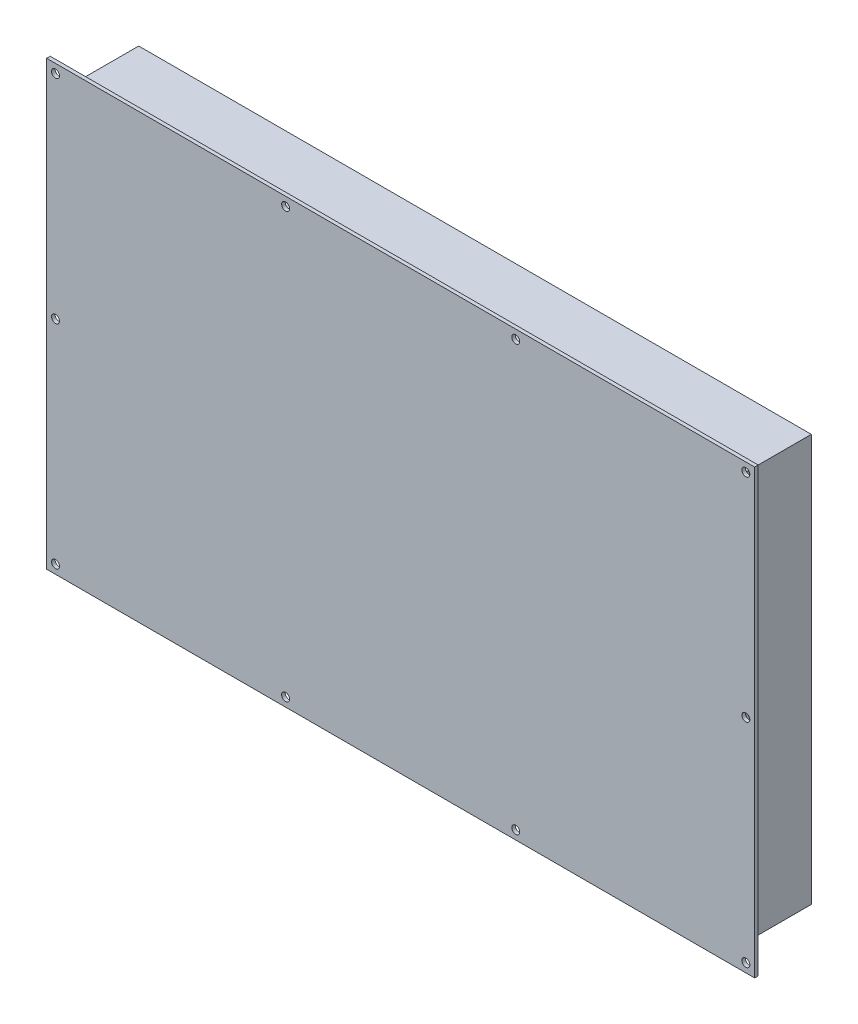
ISO-10303-21;
HEADER;
FILE_DESCRIPTION(('STEP AP214'),'2;1');
FILE_NAME('part.step','',(''),(''),'','','');
FILE_SCHEMA(('AUTOMOTIVE_DESIGN { 1 0 10303 214 1 1 1 1 }'));
ENDSEC;
DATA;
#1=APPLICATION_CONTEXT('core data for automotive mechanical design processes');
#2=APPLICATION_PROTOCOL_DEFINITION('international standard','automotive_design',2000,#1);
#3=PRODUCT_CONTEXT('',#1,'mechanical');
#4=PRODUCT('Part','Part','',(#3));
#5=PRODUCT_RELATED_PRODUCT_CATEGORY('part','',(#4));
#6=PRODUCT_DEFINITION_FORMATION('','',#4);
#7=PRODUCT_DEFINITION_CONTEXT('part definition',#1,'design');
#8=PRODUCT_DEFINITION('design','',#6,#7);
#9=PRODUCT_DEFINITION_SHAPE('','',#8);
#10=(LENGTH_UNIT() NAMED_UNIT(*) SI_UNIT(.MILLI.,.METRE.));
#11=(NAMED_UNIT(*) PLANE_ANGLE_UNIT() SI_UNIT($,.RADIAN.));
#12=(NAMED_UNIT(*) SI_UNIT($,.STERADIAN.) SOLID_ANGLE_UNIT());
#13=UNCERTAINTY_MEASURE_WITH_UNIT(LENGTH_MEASURE(1.E-05),#10,'distance_accuracy_value','');
#14=(GEOMETRIC_REPRESENTATION_CONTEXT(3) GLOBAL_UNCERTAINTY_ASSIGNED_CONTEXT((#13)) GLOBAL_UNIT_ASSIGNED_CONTEXT((#10,
#11,#12)) REPRESENTATION_CONTEXT('',''));
#15=CARTESIAN_POINT('',(0.,0.,0.));
#16=DIRECTION('',(0.,0.,1.));
#17=DIRECTION('',(1.,0.,0.));
#18=AXIS2_PLACEMENT_3D('',#15,#16,#17);
#19=CARTESIAN_POINT('',(200.,-125.,2.));
#20=DIRECTION('',(-1.,0.,0.));
#21=DIRECTION('',(0.,0.,1.));
#22=AXIS2_PLACEMENT_3D('',#19,#20,#21);
#23=PLANE('',#22);
#24=DIRECTION('',(0.,1.,0.));
#25=VECTOR('',#24,1.);
#26=CARTESIAN_POINT('',(200.,-125.,0.));
#27=LINE('',#26,#25);
#28=CARTESIAN_POINT('',(200.,-125.,0.));
#29=VERTEX_POINT('',#28);
#30=CARTESIAN_POINT('',(200.,125.,0.));
#31=VERTEX_POINT('',#30);
#32=EDGE_CURVE('E185',#29,#31,#27,.T.);
#33=ORIENTED_EDGE('',*,*,#32,.T.);
#34=DIRECTION('',(0.,0.,-1.));
#35=VECTOR('',#34,1.);
#36=CARTESIAN_POINT('',(200.,125.,2.));
#37=LINE('',#36,#35);
#38=CARTESIAN_POINT('',(200.,125.,2.));
#39=VERTEX_POINT('',#38);
#40=EDGE_CURVE('E11',#39,#31,#37,.T.);
#41=ORIENTED_EDGE('',*,*,#40,.F.);
#42=DIRECTION('',(0.,1.,0.));
#43=VECTOR('',#42,1.);
#44=CARTESIAN_POINT('',(200.,-125.,2.));
#45=LINE('',#44,#43);
#46=CARTESIAN_POINT('',(200.,-125.,2.));
#47=VERTEX_POINT('',#46);
#48=EDGE_CURVE('E188',#47,#39,#45,.T.);
#49=ORIENTED_EDGE('',*,*,#48,.F.);
#50=DIRECTION('',(0.,0.,-1.));
#51=VECTOR('',#50,1.);
#52=CARTESIAN_POINT('',(200.,-125.,2.));
#53=LINE('',#52,#51);
#54=EDGE_CURVE('E199',#47,#29,#53,.T.);
#55=ORIENTED_EDGE('',*,*,#54,.T.);
#56=EDGE_LOOP('',(#33,#41,#49,#55));
#57=FACE_BOUND('',#56,.T.);
#58=ADVANCED_FACE('F37',(#57),#23,.F.);
#59=CARTESIAN_POINT('',(-200.,125.,2.));
#60=DIRECTION('',(0.,-1.,0.));
#61=DIRECTION('',(0.,0.,-1.));
#62=AXIS2_PLACEMENT_3D('',#59,#60,#61);
#63=PLANE('',#62);
#64=DIRECTION('',(-1.,0.,0.));
#65=VECTOR('',#64,1.);
#66=CARTESIAN_POINT('',(-200.,125.,0.));
#67=LINE('',#66,#65);
#68=CARTESIAN_POINT('',(-200.,125.,0.));
#69=VERTEX_POINT('',#68);
#70=EDGE_CURVE('E202',#31,#69,#67,.T.);
#71=ORIENTED_EDGE('',*,*,#70,.T.);
#72=DIRECTION('',(0.,0.,-1.));
#73=VECTOR('',#72,1.);
#74=CARTESIAN_POINT('',(-200.,125.,2.));
#75=LINE('',#74,#73);
#76=CARTESIAN_POINT('',(-200.,125.,2.));
#77=VERTEX_POINT('',#76);
#78=EDGE_CURVE('E44',#77,#69,#75,.T.);
#79=ORIENTED_EDGE('',*,*,#78,.F.);
#80=DIRECTION('',(-1.,0.,0.));
#81=VECTOR('',#80,1.);
#82=CARTESIAN_POINT('',(-200.,125.,2.));
#83=LINE('',#82,#81);
#84=EDGE_CURVE('E191',#39,#77,#83,.T.);
#85=ORIENTED_EDGE('',*,*,#84,.F.);
#86=ORIENTED_EDGE('',*,*,#40,.T.);
#87=EDGE_LOOP('',(#71,#79,#85,#86));
#88=FACE_BOUND('',#87,.T.);
#89=ADVANCED_FACE('F233',(#88),#63,.F.);
#90=CARTESIAN_POINT('',(-200.,-125.,2.));
#91=DIRECTION('',(1.,0.,0.));
#92=DIRECTION('',(0.,0.,-1.));
#93=AXIS2_PLACEMENT_3D('',#90,#91,#92);
#94=PLANE('',#93);
#95=DIRECTION('',(0.,-1.,0.));
#96=VECTOR('',#95,1.);
#97=CARTESIAN_POINT('',(-200.,-125.,0.));
#98=LINE('',#97,#96);
#99=CARTESIAN_POINT('',(-200.,-125.,0.));
#100=VERTEX_POINT('',#99);
#101=EDGE_CURVE('E205',#69,#100,#98,.T.);
#102=ORIENTED_EDGE('',*,*,#101,.T.);
#103=DIRECTION('',(0.,0.,-1.));
#104=VECTOR('',#103,1.);
#105=CARTESIAN_POINT('',(-200.,-125.,2.));
#106=LINE('',#105,#104);
#107=CARTESIAN_POINT('',(-200.,-125.,2.));
#108=VERTEX_POINT('',#107);
#109=EDGE_CURVE('E210',#108,#100,#106,.T.);
#110=ORIENTED_EDGE('',*,*,#109,.F.);
#111=DIRECTION('',(0.,-1.,0.));
#112=VECTOR('',#111,1.);
#113=CARTESIAN_POINT('',(-200.,-125.,2.));
#114=LINE('',#113,#112);
#115=EDGE_CURVE('E195',#77,#108,#114,.T.);
#116=ORIENTED_EDGE('',*,*,#115,.F.);
#117=ORIENTED_EDGE('',*,*,#78,.T.);
#118=EDGE_LOOP('',(#102,#110,#116,#117));
#119=FACE_BOUND('',#118,.T.);
#120=ADVANCED_FACE('F217',(#119),#94,.F.);
#121=CARTESIAN_POINT('',(-200.,-125.,2.));
#122=DIRECTION('',(0.,1.,0.));
#123=DIRECTION('',(0.,0.,1.));
#124=AXIS2_PLACEMENT_3D('',#121,#122,#123);
#125=PLANE('',#124);
#126=DIRECTION('',(1.,0.,0.));
#127=VECTOR('',#126,1.);
#128=CARTESIAN_POINT('',(-200.,-125.,0.));
#129=LINE('',#128,#127);
#130=EDGE_CURVE('E192',#100,#29,#129,.T.);
#131=ORIENTED_EDGE('',*,*,#130,.T.);
#132=ORIENTED_EDGE('',*,*,#54,.F.);
#133=DIRECTION('',(1.,0.,0.));
#134=VECTOR('',#133,1.);
#135=CARTESIAN_POINT('',(-200.,-125.,2.));
#136=LINE('',#135,#134);
#137=EDGE_CURVE('E197',#108,#47,#136,.T.);
#138=ORIENTED_EDGE('',*,*,#137,.F.);
#139=ORIENTED_EDGE('',*,*,#109,.T.);
#140=EDGE_LOOP('',(#131,#132,#138,#139));
#141=FACE_BOUND('',#140,.T.);
#142=ADVANCED_FACE('F226',(#141),#125,.F.);
#143=CARTESIAN_POINT('',(0.,0.,2.));
#144=DIRECTION('',(0.,0.,-1.));
#145=DIRECTION('',(-1.,0.,0.));
#146=AXIS2_PLACEMENT_3D('',#143,#144,#145);
#147=PLANE('',#146);
#148=CARTESIAN_POINT('',(-195.,0.,2.));
#149=DIRECTION('',(0.,0.,1.));
#150=DIRECTION('',(-1.,0.,0.));
#151=AXIS2_PLACEMENT_3D('',#148,#149,#150);
#152=CIRCLE('',#151,2.25000000000001);
#153=CARTESIAN_POINT('',(-197.25,0.,2.));
#154=VERTEX_POINT('',#153);
#155=EDGE_CURVE('E153',#154,#154,#152,.T.);
#156=ORIENTED_EDGE('',*,*,#155,.F.);
#157=EDGE_LOOP('',(#156));
#158=FACE_BOUND('',#157,.T.);
#159=CARTESIAN_POINT('',(-195.,-120.,2.));
#160=DIRECTION('',(0.,0.,1.));
#161=DIRECTION('',(-1.,0.,0.));
#162=AXIS2_PLACEMENT_3D('',#159,#160,#161);
#163=CIRCLE('',#162,2.25000000000001);
#164=CARTESIAN_POINT('',(-197.25,-120.,2.));
#165=VERTEX_POINT('',#164);
#166=EDGE_CURVE('E147',#165,#165,#163,.T.);
#167=ORIENTED_EDGE('',*,*,#166,.F.);
#168=EDGE_LOOP('',(#167));
#169=FACE_BOUND('',#168,.T.);
#170=CARTESIAN_POINT('',(195.,-120.,2.));
#171=DIRECTION('',(0.,0.,1.));
#172=DIRECTION('',(-1.,0.,0.));
#173=AXIS2_PLACEMENT_3D('',#170,#171,#172);
#174=CIRCLE('',#173,2.25000000000001);
#175=CARTESIAN_POINT('',(192.75,-120.,2.));
#176=VERTEX_POINT('',#175);
#177=EDGE_CURVE('E141',#176,#176,#174,.T.);
#178=ORIENTED_EDGE('',*,*,#177,.F.);
#179=EDGE_LOOP('',(#178));
#180=FACE_BOUND('',#179,.T.);
#181=CARTESIAN_POINT('',(195.,120.,2.));
#182=DIRECTION('',(0.,0.,1.));
#183=DIRECTION('',(1.,0.,0.));
#184=AXIS2_PLACEMENT_3D('',#181,#182,#183);
#185=CIRCLE('',#184,2.25000000000001);
#186=CARTESIAN_POINT('',(197.25,120.,2.));
#187=VERTEX_POINT('',#186);
#188=EDGE_CURVE('E134',#187,#187,#185,.T.);
#189=ORIENTED_EDGE('',*,*,#188,.F.);
#190=EDGE_LOOP('',(#189));
#191=FACE_BOUND('',#190,.T.);
#192=CARTESIAN_POINT('',(64.9999999999999,120.,2.));
#193=DIRECTION('',(0.,0.,1.));
#194=DIRECTION('',(1.,0.,0.));
#195=AXIS2_PLACEMENT_3D('',#192,#193,#194);
#196=CIRCLE('',#195,2.25000000000001);
#197=CARTESIAN_POINT('',(67.25,120.,2.));
#198=VERTEX_POINT('',#197);
#199=EDGE_CURVE('E177',#198,#198,#196,.T.);
#200=ORIENTED_EDGE('',*,*,#199,.F.);
#201=EDGE_LOOP('',(#200));
#202=FACE_BOUND('',#201,.T.);
#203=CARTESIAN_POINT('',(-65.0000000000001,120.,2.));
#204=DIRECTION('',(0.,0.,1.));
#205=DIRECTION('',(1.,0.,0.));
#206=AXIS2_PLACEMENT_3D('',#203,#204,#205);
#207=CIRCLE('',#206,2.25000000000001);
#208=CARTESIAN_POINT('',(-62.75,120.,2.));
#209=VERTEX_POINT('',#208);
#210=EDGE_CURVE('E171',#209,#209,#207,.T.);
#211=ORIENTED_EDGE('',*,*,#210,.F.);
#212=EDGE_LOOP('',(#211));
#213=FACE_BOUND('',#212,.T.);
#214=CARTESIAN_POINT('',(64.9999999999999,-120.,2.));
#215=DIRECTION('',(0.,0.,1.));
#216=DIRECTION('',(-1.,0.,0.));
#217=AXIS2_PLACEMENT_3D('',#214,#215,#216);
#218=CIRCLE('',#217,2.25000000000001);
#219=CARTESIAN_POINT('',(62.7499999999999,-120.,2.));
#220=VERTEX_POINT('',#219);
#221=EDGE_CURVE('E165',#220,#220,#218,.T.);
#222=ORIENTED_EDGE('',*,*,#221,.F.);
#223=EDGE_LOOP('',(#222));
#224=FACE_BOUND('',#223,.T.);
#225=CARTESIAN_POINT('',(-65.,-120.,2.));
#226=DIRECTION('',(0.,0.,1.));
#227=DIRECTION('',(-1.,0.,0.));
#228=AXIS2_PLACEMENT_3D('',#225,#226,#227);
#229=CIRCLE('',#228,2.25000000000001);
#230=CARTESIAN_POINT('',(-67.25,-120.,2.));
#231=VERTEX_POINT('',#230);
#232=EDGE_CURVE('E158',#231,#231,#229,.T.);
#233=ORIENTED_EDGE('',*,*,#232,.F.);
#234=EDGE_LOOP('',(#233));
#235=FACE_BOUND('',#234,.T.);
#236=CARTESIAN_POINT('',(194.999999999999,0.,2.));
#237=DIRECTION('',(0.,0.,1.));
#238=DIRECTION('',(-1.,0.,0.));
#239=AXIS2_PLACEMENT_3D('',#236,#237,#238);
#240=CIRCLE('',#239,2.25000000000001);
#241=CARTESIAN_POINT('',(192.749999999999,0.,2.));
#242=VERTEX_POINT('',#241);
#243=EDGE_CURVE('E125',#242,#242,#240,.T.);
#244=ORIENTED_EDGE('',*,*,#243,.F.);
#245=EDGE_LOOP('',(#244));
#246=FACE_BOUND('',#245,.T.);
#247=CARTESIAN_POINT('',(-195.,120.,2.));
#248=DIRECTION('',(0.,0.,1.));
#249=DIRECTION('',(1.,0.,0.));
#250=AXIS2_PLACEMENT_3D('',#247,#248,#249);
#251=CIRCLE('',#250,2.25000000000001);
#252=CARTESIAN_POINT('',(-192.75,120.,2.));
#253=VERTEX_POINT('',#252);
#254=EDGE_CURVE('E182',#253,#253,#251,.T.);
#255=ORIENTED_EDGE('',*,*,#254,.F.);
#256=EDGE_LOOP('',(#255));
#257=FACE_BOUND('',#256,.T.);
#258=ORIENTED_EDGE('',*,*,#48,.T.);
#259=ORIENTED_EDGE('',*,*,#84,.T.);
#260=ORIENTED_EDGE('',*,*,#115,.T.);
#261=ORIENTED_EDGE('',*,*,#137,.T.);
#262=EDGE_LOOP('',(#258,#259,#260,#261));
#263=FACE_BOUND('',#262,.T.);
#264=ADVANCED_FACE('F232',(#158,#169,#180,#191,#202,#213,#224,#235,#246,#257,#263),#147,.F.);
#265=CARTESIAN_POINT('',(0.,0.,0.));
#266=DIRECTION('',(0.,0.,-1.));
#267=DIRECTION('',(-1.,0.,0.));
#268=AXIS2_PLACEMENT_3D('',#265,#266,#267);
#269=PLANE('',#268);
#270=DIRECTION('',(0.,1.,0.));
#271=VECTOR('',#270,1.);
#272=CARTESIAN_POINT('',(-190.,-115.,0.));
#273=LINE('',#272,#271);
#274=CARTESIAN_POINT('',(-190.,-115.,0.));
#275=VERTEX_POINT('',#274);
#276=CARTESIAN_POINT('',(-190.,115.,0.));
#277=VERTEX_POINT('',#276);
#278=EDGE_CURVE('E51',#275,#277,#273,.T.);
#279=ORIENTED_EDGE('',*,*,#278,.F.);
#280=DIRECTION('',(-1.,0.,0.));
#281=VECTOR('',#280,1.);
#282=CARTESIAN_POINT('',(190.,-115.,0.));
#283=LINE('',#282,#281);
#284=CARTESIAN_POINT('',(190.,-115.,0.));
#285=VERTEX_POINT('',#284);
#286=EDGE_CURVE('E55',#285,#275,#283,.T.);
#287=ORIENTED_EDGE('',*,*,#286,.F.);
#288=DIRECTION('',(0.,-1.,0.));
#289=VECTOR('',#288,1.);
#290=CARTESIAN_POINT('',(190.,-115.,0.));
#291=LINE('',#290,#289);
#292=CARTESIAN_POINT('',(190.,115.,0.));
#293=VERTEX_POINT('',#292);
#294=EDGE_CURVE('E433',#293,#285,#291,.T.);
#295=ORIENTED_EDGE('',*,*,#294,.F.);
#296=DIRECTION('',(1.,0.,0.));
#297=VECTOR('',#296,1.);
#298=CARTESIAN_POINT('',(190.,115.,0.));
#299=LINE('',#298,#297);
#300=EDGE_CURVE('E439',#277,#293,#299,.T.);
#301=ORIENTED_EDGE('',*,*,#300,.F.);
#302=EDGE_LOOP('',(#279,#287,#295,#301));
#303=FACE_BOUND('',#302,.T.);
#304=CARTESIAN_POINT('',(-195.,0.,0.));
#305=DIRECTION('',(0.,0.,-1.));
#306=DIRECTION('',(-1.,0.,0.));
#307=AXIS2_PLACEMENT_3D('',#304,#305,#306);
#308=CIRCLE('',#307,2.25000000000001);
#309=CARTESIAN_POINT('',(-197.25,0.,0.));
#310=VERTEX_POINT('',#309);
#311=EDGE_CURVE('E132',#310,#310,#308,.F.);
#312=ORIENTED_EDGE('',*,*,#311,.T.);
#313=EDGE_LOOP('',(#312));
#314=FACE_BOUND('',#313,.T.);
#315=CARTESIAN_POINT('',(-195.,-120.,0.));
#316=DIRECTION('',(0.,0.,-1.));
#317=DIRECTION('',(-1.,0.,0.));
#318=AXIS2_PLACEMENT_3D('',#315,#316,#317);
#319=CIRCLE('',#318,2.25000000000001);
#320=CARTESIAN_POINT('',(-197.25,-120.,0.));
#321=VERTEX_POINT('',#320);
#322=EDGE_CURVE('E150',#321,#321,#319,.F.);
#323=ORIENTED_EDGE('',*,*,#322,.T.);
#324=EDGE_LOOP('',(#323));
#325=FACE_BOUND('',#324,.T.);
#326=CARTESIAN_POINT('',(195.,-120.,0.));
#327=DIRECTION('',(0.,0.,-1.));
#328=DIRECTION('',(-1.,0.,0.));
#329=AXIS2_PLACEMENT_3D('',#326,#327,#328);
#330=CIRCLE('',#329,2.25000000000001);
#331=CARTESIAN_POINT('',(192.75,-120.,0.));
#332=VERTEX_POINT('',#331);
#333=EDGE_CURVE('E144',#332,#332,#330,.F.);
#334=ORIENTED_EDGE('',*,*,#333,.T.);
#335=EDGE_LOOP('',(#334));
#336=FACE_BOUND('',#335,.T.);
#337=CARTESIAN_POINT('',(195.,120.,0.));
#338=DIRECTION('',(0.,0.,-1.));
#339=DIRECTION('',(-1.,0.,0.));
#340=AXIS2_PLACEMENT_3D('',#337,#338,#339);
#341=CIRCLE('',#340,2.25000000000001);
#342=CARTESIAN_POINT('',(192.75,120.,0.));
#343=VERTEX_POINT('',#342);
#344=EDGE_CURVE('E138',#343,#343,#341,.F.);
#345=ORIENTED_EDGE('',*,*,#344,.T.);
#346=EDGE_LOOP('',(#345));
#347=FACE_BOUND('',#346,.T.);
#348=CARTESIAN_POINT('',(64.9999999999999,120.,0.));
#349=DIRECTION('',(0.,0.,-1.));
#350=DIRECTION('',(-1.,0.,0.));
#351=AXIS2_PLACEMENT_3D('',#348,#349,#350);
#352=CIRCLE('',#351,2.25000000000001);
#353=CARTESIAN_POINT('',(62.7499999999999,120.,0.));
#354=VERTEX_POINT('',#353);
#355=EDGE_CURVE('E137',#354,#354,#352,.F.);
#356=ORIENTED_EDGE('',*,*,#355,.T.);
#357=EDGE_LOOP('',(#356));
#358=FACE_BOUND('',#357,.T.);
#359=CARTESIAN_POINT('',(-65.0000000000001,120.,0.));
#360=DIRECTION('',(0.,0.,-1.));
#361=DIRECTION('',(-1.,0.,0.));
#362=AXIS2_PLACEMENT_3D('',#359,#360,#361);
#363=CIRCLE('',#362,2.25000000000001);
#364=CARTESIAN_POINT('',(-67.2500000000001,120.,0.));
#365=VERTEX_POINT('',#364);
#366=EDGE_CURVE('E174',#365,#365,#363,.F.);
#367=ORIENTED_EDGE('',*,*,#366,.T.);
#368=EDGE_LOOP('',(#367));
#369=FACE_BOUND('',#368,.T.);
#370=CARTESIAN_POINT('',(64.9999999999999,-120.,0.));
#371=DIRECTION('',(0.,0.,-1.));
#372=DIRECTION('',(-1.,0.,0.));
#373=AXIS2_PLACEMENT_3D('',#370,#371,#372);
#374=CIRCLE('',#373,2.25000000000001);
#375=CARTESIAN_POINT('',(62.7499999999999,-120.,0.));
#376=VERTEX_POINT('',#375);
#377=EDGE_CURVE('E168',#376,#376,#374,.F.);
#378=ORIENTED_EDGE('',*,*,#377,.T.);
#379=EDGE_LOOP('',(#378));
#380=FACE_BOUND('',#379,.T.);
#381=CARTESIAN_POINT('',(-65.,-120.,0.));
#382=DIRECTION('',(0.,0.,-1.));
#383=DIRECTION('',(-1.,0.,0.));
#384=AXIS2_PLACEMENT_3D('',#381,#382,#383);
#385=CIRCLE('',#384,2.25000000000001);
#386=CARTESIAN_POINT('',(-67.25,-120.,0.));
#387=VERTEX_POINT('',#386);
#388=EDGE_CURVE('E162',#387,#387,#385,.F.);
#389=ORIENTED_EDGE('',*,*,#388,.T.);
#390=EDGE_LOOP('',(#389));
#391=FACE_BOUND('',#390,.T.);
#392=CARTESIAN_POINT('',(194.999999999999,0.,0.));
#393=DIRECTION('',(0.,0.,-1.));
#394=DIRECTION('',(-1.,0.,0.));
#395=AXIS2_PLACEMENT_3D('',#392,#393,#394);
#396=CIRCLE('',#395,2.25000000000001);
#397=CARTESIAN_POINT('',(192.749999999999,0.,0.));
#398=VERTEX_POINT('',#397);
#399=EDGE_CURVE('E122',#398,#398,#396,.F.);
#400=ORIENTED_EDGE('',*,*,#399,.T.);
#401=EDGE_LOOP('',(#400));
#402=FACE_BOUND('',#401,.T.);
#403=CARTESIAN_POINT('',(-195.,120.,0.));
#404=DIRECTION('',(0.,0.,-1.));
#405=DIRECTION('',(-1.,0.,0.));
#406=AXIS2_PLACEMENT_3D('',#403,#404,#405);
#407=CIRCLE('',#406,2.25000000000001);
#408=CARTESIAN_POINT('',(-197.25,120.,0.));
#409=VERTEX_POINT('',#408);
#410=EDGE_CURVE('E161',#409,#409,#407,.F.);
#411=ORIENTED_EDGE('',*,*,#410,.T.);
#412=EDGE_LOOP('',(#411));
#413=FACE_BOUND('',#412,.T.);
#414=ORIENTED_EDGE('',*,*,#32,.F.);
#415=ORIENTED_EDGE('',*,*,#130,.F.);
#416=ORIENTED_EDGE('',*,*,#101,.F.);
#417=ORIENTED_EDGE('',*,*,#70,.F.);
#418=EDGE_LOOP('',(#414,#415,#416,#417));
#419=FACE_BOUND('',#418,.T.);
#420=ADVANCED_FACE('F223',(#303,#314,#325,#336,#347,#358,#369,#380,#391,#402,#413,#419),#269,.T.);
#421=CARTESIAN_POINT('',(-195.,120.,-0.00100000000000013));
#422=DIRECTION('',(0.,0.,1.));
#423=DIRECTION('',(1.,0.,0.));
#424=AXIS2_PLACEMENT_3D('',#421,#422,#423);
#425=CYLINDRICAL_SURFACE('',#424,2.25000000000001);
#426=ORIENTED_EDGE('',*,*,#410,.F.);
#427=EDGE_LOOP('',(#426));
#428=FACE_BOUND('',#427,.T.);
#429=ORIENTED_EDGE('',*,*,#254,.T.);
#430=EDGE_LOOP('',(#429));
#431=FACE_BOUND('',#430,.T.);
#432=ADVANCED_FACE('F245',(#428,#431),#425,.F.);
#433=CARTESIAN_POINT('',(194.999999999999,0.,-0.00100000000000013));
#434=DIRECTION('',(0.,0.,1.));
#435=DIRECTION('',(1.,0.,0.));
#436=AXIS2_PLACEMENT_3D('',#433,#434,#435);
#437=CYLINDRICAL_SURFACE('',#436,2.25000000000001);
#438=ORIENTED_EDGE('',*,*,#399,.F.);
#439=EDGE_LOOP('',(#438));
#440=FACE_BOUND('',#439,.T.);
#441=ORIENTED_EDGE('',*,*,#243,.T.);
#442=EDGE_LOOP('',(#441));
#443=FACE_BOUND('',#442,.T.);
#444=ADVANCED_FACE('F251',(#440,#443),#437,.F.);
#445=CARTESIAN_POINT('',(-65.,-120.,-0.00100000000000013));
#446=DIRECTION('',(0.,0.,1.));
#447=DIRECTION('',(1.,0.,0.));
#448=AXIS2_PLACEMENT_3D('',#445,#446,#447);
#449=CYLINDRICAL_SURFACE('',#448,2.25000000000001);
#450=ORIENTED_EDGE('',*,*,#388,.F.);
#451=EDGE_LOOP('',(#450));
#452=FACE_BOUND('',#451,.T.);
#453=ORIENTED_EDGE('',*,*,#232,.T.);
#454=EDGE_LOOP('',(#453));
#455=FACE_BOUND('',#454,.T.);
#456=ADVANCED_FACE('F265',(#452,#455),#449,.F.);
#457=CARTESIAN_POINT('',(64.9999999999999,-120.,-0.00100000000000013));
#458=DIRECTION('',(0.,0.,1.));
#459=DIRECTION('',(1.,0.,0.));
#460=AXIS2_PLACEMENT_3D('',#457,#458,#459);
#461=CYLINDRICAL_SURFACE('',#460,2.25000000000001);
#462=ORIENTED_EDGE('',*,*,#377,.F.);
#463=EDGE_LOOP('',(#462));
#464=FACE_BOUND('',#463,.T.);
#465=ORIENTED_EDGE('',*,*,#221,.T.);
#466=EDGE_LOOP('',(#465));
#467=FACE_BOUND('',#466,.T.);
#468=ADVANCED_FACE('F261',(#464,#467),#461,.F.);
#469=CARTESIAN_POINT('',(-65.0000000000001,120.,-0.00100000000000013));
#470=DIRECTION('',(0.,0.,1.));
#471=DIRECTION('',(1.,0.,0.));
#472=AXIS2_PLACEMENT_3D('',#469,#470,#471);
#473=CYLINDRICAL_SURFACE('',#472,2.25000000000001);
#474=ORIENTED_EDGE('',*,*,#366,.F.);
#475=EDGE_LOOP('',(#474));
#476=FACE_BOUND('',#475,.T.);
#477=ORIENTED_EDGE('',*,*,#210,.T.);
#478=EDGE_LOOP('',(#477));
#479=FACE_BOUND('',#478,.T.);
#480=ADVANCED_FACE('F257',(#476,#479),#473,.F.);
#481=CARTESIAN_POINT('',(64.9999999999999,120.,-0.00100000000000013));
#482=DIRECTION('',(0.,0.,1.));
#483=DIRECTION('',(1.,0.,0.));
#484=AXIS2_PLACEMENT_3D('',#481,#482,#483);
#485=CYLINDRICAL_SURFACE('',#484,2.25000000000001);
#486=ORIENTED_EDGE('',*,*,#355,.F.);
#487=EDGE_LOOP('',(#486));
#488=FACE_BOUND('',#487,.T.);
#489=ORIENTED_EDGE('',*,*,#199,.T.);
#490=EDGE_LOOP('',(#489));
#491=FACE_BOUND('',#490,.T.);
#492=ADVANCED_FACE('F253',(#488,#491),#485,.F.);
#493=CARTESIAN_POINT('',(195.,120.,-0.00100000000000013));
#494=DIRECTION('',(0.,0.,1.));
#495=DIRECTION('',(1.,0.,0.));
#496=AXIS2_PLACEMENT_3D('',#493,#494,#495);
#497=CYLINDRICAL_SURFACE('',#496,2.25000000000001);
#498=ORIENTED_EDGE('',*,*,#344,.F.);
#499=EDGE_LOOP('',(#498));
#500=FACE_BOUND('',#499,.T.);
#501=ORIENTED_EDGE('',*,*,#188,.T.);
#502=EDGE_LOOP('',(#501));
#503=FACE_BOUND('',#502,.T.);
#504=ADVANCED_FACE('F256',(#500,#503),#497,.F.);
#505=CARTESIAN_POINT('',(195.,-120.,-0.00100000000000013));
#506=DIRECTION('',(0.,0.,1.));
#507=DIRECTION('',(1.,0.,0.));
#508=AXIS2_PLACEMENT_3D('',#505,#506,#507);
#509=CYLINDRICAL_SURFACE('',#508,2.25000000000001);
#510=ORIENTED_EDGE('',*,*,#333,.F.);
#511=EDGE_LOOP('',(#510));
#512=FACE_BOUND('',#511,.T.);
#513=ORIENTED_EDGE('',*,*,#177,.T.);
#514=EDGE_LOOP('',(#513));
#515=FACE_BOUND('',#514,.T.);
#516=ADVANCED_FACE('F277',(#512,#515),#509,.F.);
#517=CARTESIAN_POINT('',(-195.,-120.,-0.00100000000000013));
#518=DIRECTION('',(0.,0.,1.));
#519=DIRECTION('',(1.,0.,0.));
#520=AXIS2_PLACEMENT_3D('',#517,#518,#519);
#521=CYLINDRICAL_SURFACE('',#520,2.25000000000001);
#522=ORIENTED_EDGE('',*,*,#322,.F.);
#523=EDGE_LOOP('',(#522));
#524=FACE_BOUND('',#523,.T.);
#525=ORIENTED_EDGE('',*,*,#166,.T.);
#526=EDGE_LOOP('',(#525));
#527=FACE_BOUND('',#526,.T.);
#528=ADVANCED_FACE('F273',(#524,#527),#521,.F.);
#529=CARTESIAN_POINT('',(-195.,0.,-0.00100000000000013));
#530=DIRECTION('',(0.,0.,1.));
#531=DIRECTION('',(1.,0.,0.));
#532=AXIS2_PLACEMENT_3D('',#529,#530,#531);
#533=CYLINDRICAL_SURFACE('',#532,2.25000000000001);
#534=ORIENTED_EDGE('',*,*,#311,.F.);
#535=EDGE_LOOP('',(#534));
#536=FACE_BOUND('',#535,.T.);
#537=ORIENTED_EDGE('',*,*,#155,.T.);
#538=EDGE_LOOP('',(#537));
#539=FACE_BOUND('',#538,.T.);
#540=ADVANCED_FACE('F270',(#536,#539),#533,.F.);
#541=CARTESIAN_POINT('',(-190.,-115.,-40.));
#542=DIRECTION('',(1.,0.,0.));
#543=DIRECTION('',(0.,0.,-1.));
#544=AXIS2_PLACEMENT_3D('',#541,#542,#543);
#545=PLANE('',#544);
#546=ORIENTED_EDGE('',*,*,#278,.T.);
#547=DIRECTION('',(0.,0.,1.));
#548=VECTOR('',#547,1.);
#549=CARTESIAN_POINT('',(-190.,115.,-40.));
#550=LINE('',#549,#548);
#551=CARTESIAN_POINT('',(-190.,115.,-40.));
#552=VERTEX_POINT('',#551);
#553=EDGE_CURVE('E104',#552,#277,#550,.T.);
#554=ORIENTED_EDGE('',*,*,#553,.F.);
#555=DIRECTION('',(0.,1.,0.));
#556=VECTOR('',#555,1.);
#557=CARTESIAN_POINT('',(-190.,-115.,-40.));
#558=LINE('',#557,#556);
#559=CARTESIAN_POINT('',(-190.,-115.,-40.));
#560=VERTEX_POINT('',#559);
#561=EDGE_CURVE('E111',#560,#552,#558,.T.);
#562=ORIENTED_EDGE('',*,*,#561,.F.);
#563=DIRECTION('',(0.,0.,1.));
#564=VECTOR('',#563,1.);
#565=CARTESIAN_POINT('',(-190.,-115.,-40.));
#566=LINE('',#565,#564);
#567=EDGE_CURVE('E431',#560,#275,#566,.T.);
#568=ORIENTED_EDGE('',*,*,#567,.T.);
#569=EDGE_LOOP('',(#546,#554,#562,#568));
#570=FACE_BOUND('',#569,.T.);
#571=ADVANCED_FACE('F121',(#570),#545,.F.);
#572=CARTESIAN_POINT('',(190.,115.,-40.));
#573=DIRECTION('',(0.,-1.,0.));
#574=DIRECTION('',(0.,0.,-1.));
#575=AXIS2_PLACEMENT_3D('',#572,#573,#574);
#576=PLANE('',#575);
#577=ORIENTED_EDGE('',*,*,#300,.T.);
#578=DIRECTION('',(0.,0.,1.));
#579=VECTOR('',#578,1.);
#580=CARTESIAN_POINT('',(190.,115.,-40.));
#581=LINE('',#580,#579);
#582=CARTESIAN_POINT('',(190.,115.,-40.));
#583=VERTEX_POINT('',#582);
#584=EDGE_CURVE('E106',#583,#293,#581,.T.);
#585=ORIENTED_EDGE('',*,*,#584,.F.);
#586=DIRECTION('',(1.,0.,0.));
#587=VECTOR('',#586,1.);
#588=CARTESIAN_POINT('',(190.,115.,-40.));
#589=LINE('',#588,#587);
#590=EDGE_CURVE('E99',#552,#583,#589,.T.);
#591=ORIENTED_EDGE('',*,*,#590,.F.);
#592=ORIENTED_EDGE('',*,*,#553,.T.);
#593=EDGE_LOOP('',(#577,#585,#591,#592));
#594=FACE_BOUND('',#593,.T.);
#595=ADVANCED_FACE('F102',(#594),#576,.F.);
#596=CARTESIAN_POINT('',(190.,-115.,-40.));
#597=DIRECTION('',(-1.,0.,0.));
#598=DIRECTION('',(0.,0.,1.));
#599=AXIS2_PLACEMENT_3D('',#596,#597,#598);
#600=PLANE('',#599);
#601=ORIENTED_EDGE('',*,*,#294,.T.);
#602=DIRECTION('',(0.,0.,1.));
#603=VECTOR('',#602,1.);
#604=CARTESIAN_POINT('',(190.,-115.,-40.));
#605=LINE('',#604,#603);
#606=CARTESIAN_POINT('',(190.,-115.,-40.));
#607=VERTEX_POINT('',#606);
#608=EDGE_CURVE('E127',#607,#285,#605,.T.);
#609=ORIENTED_EDGE('',*,*,#608,.F.);
#610=DIRECTION('',(0.,-1.,0.));
#611=VECTOR('',#610,1.);
#612=CARTESIAN_POINT('',(190.,-115.,-40.));
#613=LINE('',#612,#611);
#614=EDGE_CURVE('E110',#583,#607,#613,.T.);
#615=ORIENTED_EDGE('',*,*,#614,.F.);
#616=ORIENTED_EDGE('',*,*,#584,.T.);
#617=EDGE_LOOP('',(#601,#609,#615,#616));
#618=FACE_BOUND('',#617,.T.);
#619=ADVANCED_FACE('F292',(#618),#600,.F.);
#620=CARTESIAN_POINT('',(190.,-115.,-40.));
#621=DIRECTION('',(0.,1.,0.));
#622=DIRECTION('',(0.,0.,1.));
#623=AXIS2_PLACEMENT_3D('',#620,#621,#622);
#624=PLANE('',#623);
#625=ORIENTED_EDGE('',*,*,#286,.T.);
#626=ORIENTED_EDGE('',*,*,#567,.F.);
#627=DIRECTION('',(-1.,0.,0.));
#628=VECTOR('',#627,1.);
#629=CARTESIAN_POINT('',(190.,-115.,-40.));
#630=LINE('',#629,#628);
#631=EDGE_CURVE('E116',#607,#560,#630,.T.);
#632=ORIENTED_EDGE('',*,*,#631,.F.);
#633=ORIENTED_EDGE('',*,*,#608,.T.);
#634=EDGE_LOOP('',(#625,#626,#632,#633));
#635=FACE_BOUND('',#634,.T.);
#636=ADVANCED_FACE('F295',(#635),#624,.F.);
#637=CARTESIAN_POINT('',(0.,0.,-40.));
#638=DIRECTION('',(0.,0.,1.));
#639=DIRECTION('',(1.,0.,0.));
#640=AXIS2_PLACEMENT_3D('',#637,#638,#639);
#641=PLANE('',#640);
#642=ORIENTED_EDGE('',*,*,#561,.T.);
#643=ORIENTED_EDGE('',*,*,#590,.T.);
#644=ORIENTED_EDGE('',*,*,#614,.T.);
#645=ORIENTED_EDGE('',*,*,#631,.T.);
#646=EDGE_LOOP('',(#642,#643,#644,#645));
#647=FACE_BOUND('',#646,.T.);
#648=ADVANCED_FACE('F114',(#647),#641,.F.);
#649=CLOSED_SHELL('',(#58,#89,#120,#142,#264,#420,#432,#444,#456,#468,#480,#492,#504,#516,#528,
#540,#571,#595,#619,#636,#648));
#650=MANIFOLD_SOLID_BREP('B2',#649);
#651=ADVANCED_BREP_SHAPE_REPRESENTATION('',(#18,#650),#14);
#652=SHAPE_DEFINITION_REPRESENTATION(#9,#651);
ENDSEC;
END-ISO-10303-21;
